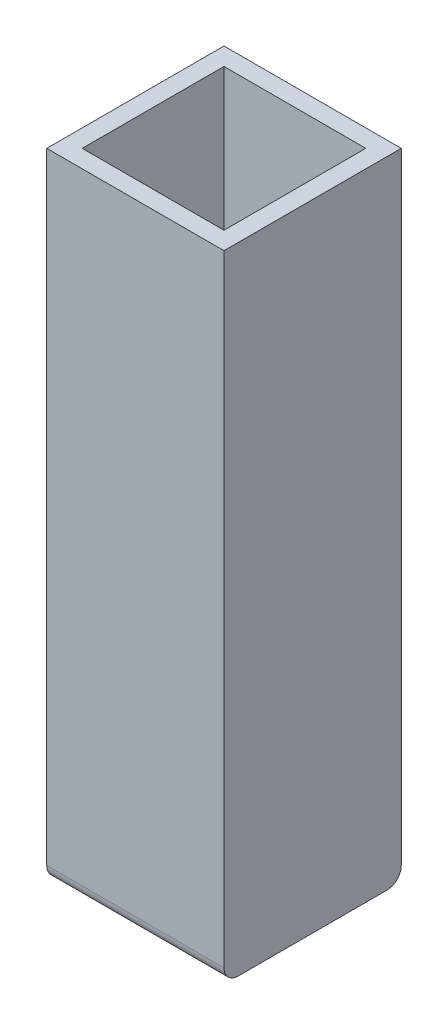
ISO-10303-21;
HEADER;
FILE_DESCRIPTION(('STEP AP214'),'2;1');
FILE_NAME('part.step','',(''),(''),'','','');
FILE_SCHEMA(('AUTOMOTIVE_DESIGN { 1 0 10303 214 1 1 1 1 }'));
ENDSEC;
DATA;
#1=APPLICATION_CONTEXT('core data for automotive mechanical design processes');
#2=APPLICATION_PROTOCOL_DEFINITION('international standard','automotive_design',2000,#1);
#3=PRODUCT_CONTEXT('',#1,'mechanical');
#4=PRODUCT('Part','Part','',(#3));
#5=PRODUCT_RELATED_PRODUCT_CATEGORY('part','',(#4));
#6=PRODUCT_DEFINITION_FORMATION('','',#4);
#7=PRODUCT_DEFINITION_CONTEXT('part definition',#1,'design');
#8=PRODUCT_DEFINITION('design','',#6,#7);
#9=PRODUCT_DEFINITION_SHAPE('','',#8);
#10=(LENGTH_UNIT() NAMED_UNIT(*) SI_UNIT(.MILLI.,.METRE.));
#11=(NAMED_UNIT(*) PLANE_ANGLE_UNIT() SI_UNIT($,.RADIAN.));
#12=(NAMED_UNIT(*) SI_UNIT($,.STERADIAN.) SOLID_ANGLE_UNIT());
#13=UNCERTAINTY_MEASURE_WITH_UNIT(LENGTH_MEASURE(1.E-05),#10,'distance_accuracy_value','');
#14=(GEOMETRIC_REPRESENTATION_CONTEXT(3) GLOBAL_UNCERTAINTY_ASSIGNED_CONTEXT((#13)) GLOBAL_UNIT_ASSIGNED_CONTEXT((#10,
#11,#12)) REPRESENTATION_CONTEXT('',''));
#15=CARTESIAN_POINT('',(0.,0.,0.));
#16=DIRECTION('',(0.,0.,1.));
#17=DIRECTION('',(1.,0.,0.));
#18=AXIS2_PLACEMENT_3D('',#15,#16,#17);
#19=CARTESIAN_POINT('',(0.,44.8,0.));
#20=DIRECTION('',(1.,0.,0.));
#21=DIRECTION('',(0.,0.,-1.));
#22=AXIS2_PLACEMENT_3D('',#19,#20,#21);
#23=PLANE('',#22);
#24=DIRECTION('',(0.,0.,1.));
#25=VECTOR('',#24,1.);
#26=CARTESIAN_POINT('',(0.,0.,0.));
#27=LINE('',#26,#25);
#28=CARTESIAN_POINT('',(0.,0.,-11.5));
#29=VERTEX_POINT('',#28);
#30=CARTESIAN_POINT('',(0.,0.,-1.));
#31=VERTEX_POINT('',#30);
#32=EDGE_CURVE('E154',#29,#31,#27,.T.);
#33=ORIENTED_EDGE('',*,*,#32,.T.);
#34=CARTESIAN_POINT('',(0.,1.,-1.));
#35=DIRECTION('',(1.,0.,0.));
#36=DIRECTION('',(0.,0.,-1.));
#37=AXIS2_PLACEMENT_3D('',#34,#35,#36);
#38=CIRCLE('',#37,1.);
#39=CARTESIAN_POINT('',(0.,1.,0.));
#40=VERTEX_POINT('',#39);
#41=EDGE_CURVE('E44',#31,#40,#38,.F.);
#42=ORIENTED_EDGE('',*,*,#41,.T.);
#43=DIRECTION('',(0.,-1.,0.));
#44=VECTOR('',#43,1.);
#45=CARTESIAN_POINT('',(0.,44.8,0.));
#46=LINE('',#45,#44);
#47=CARTESIAN_POINT('',(0.,44.8,0.));
#48=VERTEX_POINT('',#47);
#49=EDGE_CURVE('E180',#48,#40,#46,.T.);
#50=ORIENTED_EDGE('',*,*,#49,.F.);
#51=DIRECTION('',(0.,0.,1.));
#52=VECTOR('',#51,1.);
#53=CARTESIAN_POINT('',(0.,44.8,0.));
#54=LINE('',#53,#52);
#55=CARTESIAN_POINT('',(0.,44.8,-12.5));
#56=VERTEX_POINT('',#55);
#57=EDGE_CURVE('E158',#56,#48,#54,.T.);
#58=ORIENTED_EDGE('',*,*,#57,.F.);
#59=DIRECTION('',(0.,-1.,0.));
#60=VECTOR('',#59,1.);
#61=CARTESIAN_POINT('',(0.,44.8,-12.5));
#62=LINE('',#61,#60);
#63=CARTESIAN_POINT('',(0.,1.,-12.5));
#64=VERTEX_POINT('',#63);
#65=EDGE_CURVE('E168',#56,#64,#62,.T.);
#66=ORIENTED_EDGE('',*,*,#65,.T.);
#67=CARTESIAN_POINT('',(0.,1.,-11.5));
#68=DIRECTION('',(1.,0.,0.));
#69=DIRECTION('',(0.,0.,-1.));
#70=AXIS2_PLACEMENT_3D('',#67,#68,#69);
#71=CIRCLE('',#70,1.);
#72=EDGE_CURVE('E51',#64,#29,#71,.F.);
#73=ORIENTED_EDGE('',*,*,#72,.T.);
#74=EDGE_LOOP('',(#33,#42,#50,#58,#66,#73));
#75=FACE_BOUND('',#74,.T.);
#76=ADVANCED_FACE('F36',(#75),#23,.F.);
#77=CARTESIAN_POINT('',(0.,44.8,0.));
#78=DIRECTION('',(0.,0.,-1.));
#79=DIRECTION('',(-1.,0.,0.));
#80=AXIS2_PLACEMENT_3D('',#77,#78,#79);
#81=PLANE('',#80);
#82=ORIENTED_EDGE('',*,*,#49,.T.);
#83=DIRECTION('',(1.,0.,0.));
#84=VECTOR('',#83,1.);
#85=CARTESIAN_POINT('',(12.5,1.,0.));
#86=LINE('',#85,#84);
#87=CARTESIAN_POINT('',(12.5,1.,0.));
#88=VERTEX_POINT('',#87);
#89=EDGE_CURVE('E183',#40,#88,#86,.T.);
#90=ORIENTED_EDGE('',*,*,#89,.T.);
#91=DIRECTION('',(0.,-1.,0.));
#92=VECTOR('',#91,1.);
#93=CARTESIAN_POINT('',(12.5,44.8,0.));
#94=LINE('',#93,#92);
#95=CARTESIAN_POINT('',(12.5,44.8,0.));
#96=VERTEX_POINT('',#95);
#97=EDGE_CURVE('E177',#96,#88,#94,.T.);
#98=ORIENTED_EDGE('',*,*,#97,.F.);
#99=DIRECTION('',(1.,0.,0.));
#100=VECTOR('',#99,1.);
#101=CARTESIAN_POINT('',(0.,44.8,0.));
#102=LINE('',#101,#100);
#103=EDGE_CURVE('E161',#48,#96,#102,.T.);
#104=ORIENTED_EDGE('',*,*,#103,.F.);
#105=EDGE_LOOP('',(#82,#90,#98,#104));
#106=FACE_BOUND('',#105,.T.);
#107=ADVANCED_FACE('F200',(#106),#81,.F.);
#108=CARTESIAN_POINT('',(12.5,44.8,0.));
#109=DIRECTION('',(-1.,0.,0.));
#110=DIRECTION('',(0.,0.,1.));
#111=AXIS2_PLACEMENT_3D('',#108,#109,#110);
#112=PLANE('',#111);
#113=ORIENTED_EDGE('',*,*,#97,.T.);
#114=CARTESIAN_POINT('',(12.5,1.,-1.));
#115=DIRECTION('',(-1.,0.,0.));
#116=DIRECTION('',(0.,0.,1.));
#117=AXIS2_PLACEMENT_3D('',#114,#115,#116);
#118=CIRCLE('',#117,1.);
#119=CARTESIAN_POINT('',(12.5,0.,-1.));
#120=VERTEX_POINT('',#119);
#121=EDGE_CURVE('E188',#88,#120,#118,.F.);
#122=ORIENTED_EDGE('',*,*,#121,.T.);
#123=DIRECTION('',(0.,0.,-1.));
#124=VECTOR('',#123,1.);
#125=CARTESIAN_POINT('',(12.5,0.,0.));
#126=LINE('',#125,#124);
#127=CARTESIAN_POINT('',(12.5,0.,-11.5));
#128=VERTEX_POINT('',#127);
#129=EDGE_CURVE('E162',#120,#128,#126,.T.);
#130=ORIENTED_EDGE('',*,*,#129,.T.);
#131=CARTESIAN_POINT('',(12.5,1.,-11.5));
#132=DIRECTION('',(-1.,0.,0.));
#133=DIRECTION('',(0.,0.,1.));
#134=AXIS2_PLACEMENT_3D('',#131,#132,#133);
#135=CIRCLE('',#134,1.);
#136=CARTESIAN_POINT('',(12.5,1.,-12.5));
#137=VERTEX_POINT('',#136);
#138=EDGE_CURVE('E186',#128,#137,#135,.F.);
#139=ORIENTED_EDGE('',*,*,#138,.T.);
#140=DIRECTION('',(0.,-1.,0.));
#141=VECTOR('',#140,1.);
#142=CARTESIAN_POINT('',(12.5,44.8,-12.5));
#143=LINE('',#142,#141);
#144=CARTESIAN_POINT('',(12.5,44.8,-12.5));
#145=VERTEX_POINT('',#144);
#146=EDGE_CURVE('E174',#145,#137,#143,.T.);
#147=ORIENTED_EDGE('',*,*,#146,.F.);
#148=DIRECTION('',(0.,0.,-1.));
#149=VECTOR('',#148,1.);
#150=CARTESIAN_POINT('',(12.5,44.8,0.));
#151=LINE('',#150,#149);
#152=EDGE_CURVE('E164',#96,#145,#151,.T.);
#153=ORIENTED_EDGE('',*,*,#152,.F.);
#154=EDGE_LOOP('',(#113,#122,#130,#139,#147,#153));
#155=FACE_BOUND('',#154,.T.);
#156=ADVANCED_FACE('F204',(#155),#112,.F.);
#157=CARTESIAN_POINT('',(0.,44.8,-12.5));
#158=DIRECTION('',(0.,0.,1.));
#159=DIRECTION('',(1.,0.,0.));
#160=AXIS2_PLACEMENT_3D('',#157,#158,#159);
#161=PLANE('',#160);
#162=ORIENTED_EDGE('',*,*,#146,.T.);
#163=DIRECTION('',(-1.,0.,0.));
#164=VECTOR('',#163,1.);
#165=CARTESIAN_POINT('',(0.,1.,-12.5));
#166=LINE('',#165,#164);
#167=EDGE_CURVE('E11',#137,#64,#166,.T.);
#168=ORIENTED_EDGE('',*,*,#167,.T.);
#169=ORIENTED_EDGE('',*,*,#65,.F.);
#170=DIRECTION('',(-1.,0.,0.));
#171=VECTOR('',#170,1.);
#172=CARTESIAN_POINT('',(0.,44.8,-12.5));
#173=LINE('',#172,#171);
#174=EDGE_CURVE('E166',#145,#56,#173,.T.);
#175=ORIENTED_EDGE('',*,*,#174,.F.);
#176=EDGE_LOOP('',(#162,#168,#169,#175));
#177=FACE_BOUND('',#176,.T.);
#178=ADVANCED_FACE('F211',(#177),#161,.F.);
#179=CARTESIAN_POINT('',(0.,44.8,0.));
#180=DIRECTION('',(0.,-1.,0.));
#181=DIRECTION('',(0.,0.,-1.));
#182=AXIS2_PLACEMENT_3D('',#179,#180,#181);
#183=PLANE('',#182);
#184=DIRECTION('',(1.,0.,0.));
#185=VECTOR('',#184,1.);
#186=CARTESIAN_POINT('',(1.25,44.8,-1.25));
#187=LINE('',#186,#185);
#188=CARTESIAN_POINT('',(1.25,44.8,-1.25));
#189=VERTEX_POINT('',#188);
#190=CARTESIAN_POINT('',(11.25,44.8,-1.25));
#191=VERTEX_POINT('',#190);
#192=EDGE_CURVE('E148',#189,#191,#187,.T.);
#193=ORIENTED_EDGE('',*,*,#192,.F.);
#194=DIRECTION('',(0.,0.,1.));
#195=VECTOR('',#194,1.);
#196=CARTESIAN_POINT('',(1.25,44.8,-11.25));
#197=LINE('',#196,#195);
#198=CARTESIAN_POINT('',(1.25,44.8,-11.25));
#199=VERTEX_POINT('',#198);
#200=EDGE_CURVE('E122',#199,#189,#197,.T.);
#201=ORIENTED_EDGE('',*,*,#200,.F.);
#202=DIRECTION('',(-1.,0.,0.));
#203=VECTOR('',#202,1.);
#204=CARTESIAN_POINT('',(1.25,44.8,-11.25));
#205=LINE('',#204,#203);
#206=CARTESIAN_POINT('',(11.25,44.8,-11.25));
#207=VERTEX_POINT('',#206);
#208=EDGE_CURVE('E139',#207,#199,#205,.T.);
#209=ORIENTED_EDGE('',*,*,#208,.F.);
#210=DIRECTION('',(0.,0.,-1.));
#211=VECTOR('',#210,1.);
#212=CARTESIAN_POINT('',(11.25,44.8,-11.25));
#213=LINE('',#212,#211);
#214=EDGE_CURVE('E142',#191,#207,#213,.T.);
#215=ORIENTED_EDGE('',*,*,#214,.F.);
#216=EDGE_LOOP('',(#193,#201,#209,#215));
#217=FACE_BOUND('',#216,.T.);
#218=ORIENTED_EDGE('',*,*,#57,.T.);
#219=ORIENTED_EDGE('',*,*,#103,.T.);
#220=ORIENTED_EDGE('',*,*,#152,.T.);
#221=ORIENTED_EDGE('',*,*,#174,.T.);
#222=EDGE_LOOP('',(#218,#219,#220,#221));
#223=FACE_BOUND('',#222,.T.);
#224=ADVANCED_FACE('F214',(#217,#223),#183,.F.);
#225=CARTESIAN_POINT('',(0.,0.,0.));
#226=DIRECTION('',(0.,-1.,0.));
#227=DIRECTION('',(0.,0.,-1.));
#228=AXIS2_PLACEMENT_3D('',#225,#226,#227);
#229=PLANE('',#228);
#230=ORIENTED_EDGE('',*,*,#129,.F.);
#231=DIRECTION('',(1.,0.,0.));
#232=VECTOR('',#231,1.);
#233=CARTESIAN_POINT('',(0.,0.,-1.));
#234=LINE('',#233,#232);
#235=EDGE_CURVE('E58',#120,#31,#234,.F.);
#236=ORIENTED_EDGE('',*,*,#235,.T.);
#237=ORIENTED_EDGE('',*,*,#32,.F.);
#238=DIRECTION('',(-1.,0.,0.));
#239=VECTOR('',#238,1.);
#240=CARTESIAN_POINT('',(12.5,0.,-11.5));
#241=LINE('',#240,#239);
#242=EDGE_CURVE('E190',#29,#128,#241,.F.);
#243=ORIENTED_EDGE('',*,*,#242,.T.);
#244=EDGE_LOOP('',(#230,#236,#237,#243));
#245=FACE_BOUND('',#244,.T.);
#246=ADVANCED_FACE('F207',(#245),#229,.T.);
#247=CARTESIAN_POINT('',(1.25,0.800000000000002,-11.25));
#248=DIRECTION('',(-1.,0.,0.));
#249=DIRECTION('',(0.,0.,1.));
#250=AXIS2_PLACEMENT_3D('',#247,#248,#249);
#251=PLANE('',#250);
#252=ORIENTED_EDGE('',*,*,#200,.T.);
#253=DIRECTION('',(0.,1.,0.));
#254=VECTOR('',#253,1.);
#255=CARTESIAN_POINT('',(1.25,0.800000000000002,-1.25));
#256=LINE('',#255,#254);
#257=CARTESIAN_POINT('',(1.25,0.800000000000002,-1.25));
#258=VERTEX_POINT('',#257);
#259=EDGE_CURVE('E115',#258,#189,#256,.T.);
#260=ORIENTED_EDGE('',*,*,#259,.F.);
#261=DIRECTION('',(0.,0.,1.));
#262=VECTOR('',#261,1.);
#263=CARTESIAN_POINT('',(1.25,0.800000000000002,-11.25));
#264=LINE('',#263,#262);
#265=CARTESIAN_POINT('',(1.25,0.800000000000002,-11.25));
#266=VERTEX_POINT('',#265);
#267=EDGE_CURVE('E119',#266,#258,#264,.T.);
#268=ORIENTED_EDGE('',*,*,#267,.F.);
#269=DIRECTION('',(0.,1.,0.));
#270=VECTOR('',#269,1.);
#271=CARTESIAN_POINT('',(1.25,0.800000000000002,-11.25));
#272=LINE('',#271,#270);
#273=EDGE_CURVE('E152',#266,#199,#272,.T.);
#274=ORIENTED_EDGE('',*,*,#273,.T.);
#275=EDGE_LOOP('',(#252,#260,#268,#274));
#276=FACE_BOUND('',#275,.T.);
#277=ADVANCED_FACE('F117',(#276),#251,.F.);
#278=CARTESIAN_POINT('',(1.25,0.800000000000002,-11.25));
#279=DIRECTION('',(0.,0.,-1.));
#280=DIRECTION('',(-1.,0.,0.));
#281=AXIS2_PLACEMENT_3D('',#278,#279,#280);
#282=PLANE('',#281);
#283=ORIENTED_EDGE('',*,*,#208,.T.);
#284=ORIENTED_EDGE('',*,*,#273,.F.);
#285=DIRECTION('',(-1.,0.,0.));
#286=VECTOR('',#285,1.);
#287=CARTESIAN_POINT('',(1.25,0.800000000000002,-11.25));
#288=LINE('',#287,#286);
#289=CARTESIAN_POINT('',(11.25,0.800000000000002,-11.25));
#290=VERTEX_POINT('',#289);
#291=EDGE_CURVE('E127',#290,#266,#288,.T.);
#292=ORIENTED_EDGE('',*,*,#291,.F.);
#293=DIRECTION('',(0.,1.,0.));
#294=VECTOR('',#293,1.);
#295=CARTESIAN_POINT('',(11.25,0.800000000000002,-11.25));
#296=LINE('',#295,#294);
#297=EDGE_CURVE('E155',#290,#207,#296,.T.);
#298=ORIENTED_EDGE('',*,*,#297,.T.);
#299=EDGE_LOOP('',(#283,#284,#292,#298));
#300=FACE_BOUND('',#299,.T.);
#301=ADVANCED_FACE('F244',(#300),#282,.F.);
#302=CARTESIAN_POINT('',(11.25,0.800000000000002,-11.25));
#303=DIRECTION('',(1.,0.,0.));
#304=DIRECTION('',(0.,0.,-1.));
#305=AXIS2_PLACEMENT_3D('',#302,#303,#304);
#306=PLANE('',#305);
#307=ORIENTED_EDGE('',*,*,#214,.T.);
#308=ORIENTED_EDGE('',*,*,#297,.F.);
#309=DIRECTION('',(0.,0.,-1.));
#310=VECTOR('',#309,1.);
#311=CARTESIAN_POINT('',(11.25,0.800000000000002,-11.25));
#312=LINE('',#311,#310);
#313=CARTESIAN_POINT('',(11.25,0.800000000000002,-1.25));
#314=VERTEX_POINT('',#313);
#315=EDGE_CURVE('E135',#314,#290,#312,.T.);
#316=ORIENTED_EDGE('',*,*,#315,.F.);
#317=DIRECTION('',(0.,1.,0.));
#318=VECTOR('',#317,1.);
#319=CARTESIAN_POINT('',(11.25,0.800000000000002,-1.25));
#320=LINE('',#319,#318);
#321=EDGE_CURVE('E126',#314,#191,#320,.T.);
#322=ORIENTED_EDGE('',*,*,#321,.T.);
#323=EDGE_LOOP('',(#307,#308,#316,#322));
#324=FACE_BOUND('',#323,.T.);
#325=ADVANCED_FACE('F241',(#324),#306,.F.);
#326=CARTESIAN_POINT('',(1.25,0.800000000000002,-1.25));
#327=DIRECTION('',(0.,0.,1.));
#328=DIRECTION('',(1.,0.,0.));
#329=AXIS2_PLACEMENT_3D('',#326,#327,#328);
#330=PLANE('',#329);
#331=ORIENTED_EDGE('',*,*,#192,.T.);
#332=ORIENTED_EDGE('',*,*,#321,.F.);
#333=DIRECTION('',(1.,0.,0.));
#334=VECTOR('',#333,1.);
#335=CARTESIAN_POINT('',(1.25,0.800000000000002,-1.25));
#336=LINE('',#335,#334);
#337=EDGE_CURVE('E130',#258,#314,#336,.T.);
#338=ORIENTED_EDGE('',*,*,#337,.F.);
#339=ORIENTED_EDGE('',*,*,#259,.T.);
#340=EDGE_LOOP('',(#331,#332,#338,#339));
#341=FACE_BOUND('',#340,.T.);
#342=ADVANCED_FACE('F131',(#341),#330,.F.);
#343=CARTESIAN_POINT('',(0.,0.800000000000002,0.));
#344=DIRECTION('',(0.,1.,0.));
#345=DIRECTION('',(0.,0.,1.));
#346=AXIS2_PLACEMENT_3D('',#343,#344,#345);
#347=PLANE('',#346);
#348=ORIENTED_EDGE('',*,*,#267,.T.);
#349=ORIENTED_EDGE('',*,*,#337,.T.);
#350=ORIENTED_EDGE('',*,*,#315,.T.);
#351=ORIENTED_EDGE('',*,*,#291,.T.);
#352=EDGE_LOOP('',(#348,#349,#350,#351));
#353=FACE_BOUND('',#352,.T.);
#354=ADVANCED_FACE('F137',(#353),#347,.T.);
#355=CARTESIAN_POINT('',(0.,1.,-1.));
#356=DIRECTION('',(-1.,0.,0.));
#357=DIRECTION('',(0.,0.,1.));
#358=AXIS2_PLACEMENT_3D('',#355,#356,#357);
#359=CYLINDRICAL_SURFACE('',#358,1.);
#360=ORIENTED_EDGE('',*,*,#41,.F.);
#361=ORIENTED_EDGE('',*,*,#235,.F.);
#362=ORIENTED_EDGE('',*,*,#121,.F.);
#363=ORIENTED_EDGE('',*,*,#89,.F.);
#364=EDGE_LOOP('',(#360,#361,#362,#363));
#365=FACE_BOUND('',#364,.T.);
#366=ADVANCED_FACE('F202',(#365),#359,.T.);
#367=CARTESIAN_POINT('',(0.,1.,-11.5));
#368=DIRECTION('',(1.,0.,0.));
#369=DIRECTION('',(0.,0.,-1.));
#370=AXIS2_PLACEMENT_3D('',#367,#368,#369);
#371=CYLINDRICAL_SURFACE('',#370,1.);
#372=ORIENTED_EDGE('',*,*,#138,.F.);
#373=ORIENTED_EDGE('',*,*,#242,.F.);
#374=ORIENTED_EDGE('',*,*,#72,.F.);
#375=ORIENTED_EDGE('',*,*,#167,.F.);
#376=EDGE_LOOP('',(#372,#373,#374,#375));
#377=FACE_BOUND('',#376,.T.);
#378=ADVANCED_FACE('F38',(#377),#371,.T.);
#379=CLOSED_SHELL('',(#76,#107,#156,#178,#224,#246,#277,#301,#325,#342,#354,#366,#378));
#380=MANIFOLD_SOLID_BREP('B2',#379);
#381=ADVANCED_BREP_SHAPE_REPRESENTATION('',(#18,#380),#14);
#382=SHAPE_DEFINITION_REPRESENTATION(#9,#381);
ENDSEC;
END-ISO-10303-21;
